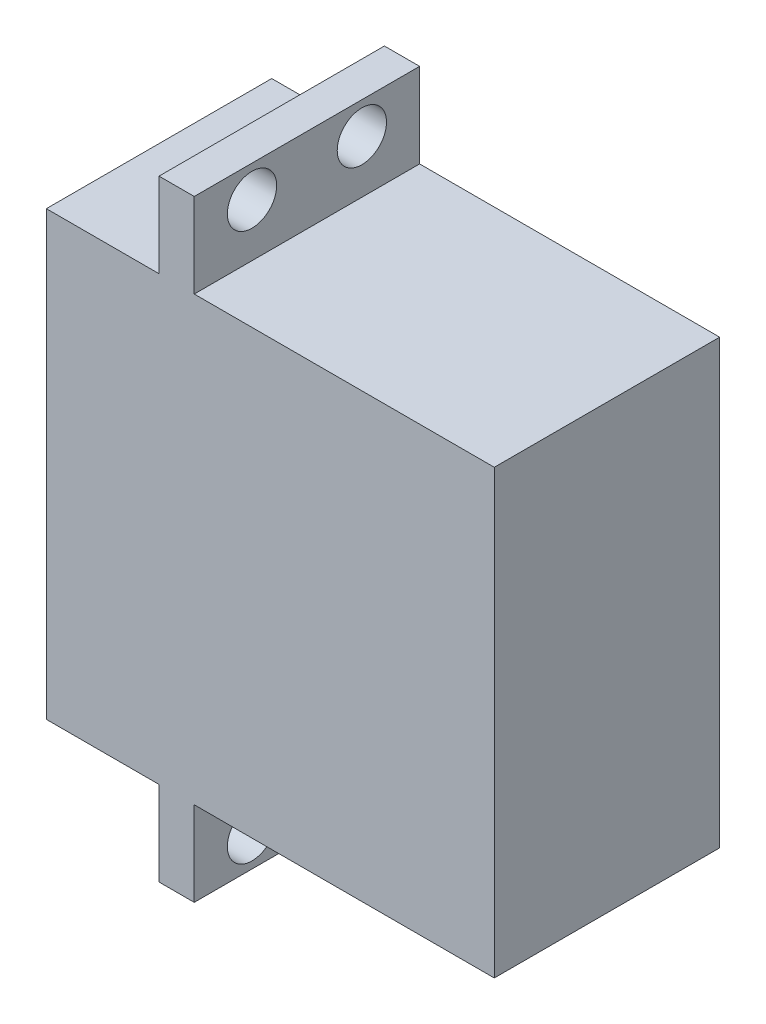
ISO-10303-21;
HEADER;
FILE_DESCRIPTION(('STEP AP214'),'2;1');
FILE_NAME('part.step','',(''),(''),'','','');
FILE_SCHEMA(('AUTOMOTIVE_DESIGN { 1 0 10303 214 1 1 1 1 }'));
ENDSEC;
DATA;
#1=APPLICATION_CONTEXT('core data for automotive mechanical design processes');
#2=APPLICATION_PROTOCOL_DEFINITION('international standard','automotive_design',2000,#1);
#3=PRODUCT_CONTEXT('',#1,'mechanical');
#4=PRODUCT('Part','Part','',(#3));
#5=PRODUCT_RELATED_PRODUCT_CATEGORY('part','',(#4));
#6=PRODUCT_DEFINITION_FORMATION('','',#4);
#7=PRODUCT_DEFINITION_CONTEXT('part definition',#1,'design');
#8=PRODUCT_DEFINITION('design','',#6,#7);
#9=PRODUCT_DEFINITION_SHAPE('','',#8);
#10=(LENGTH_UNIT() NAMED_UNIT(*) SI_UNIT(.MILLI.,.METRE.));
#11=(NAMED_UNIT(*) PLANE_ANGLE_UNIT() SI_UNIT($,.RADIAN.));
#12=(NAMED_UNIT(*) SI_UNIT($,.STERADIAN.) SOLID_ANGLE_UNIT());
#13=UNCERTAINTY_MEASURE_WITH_UNIT(LENGTH_MEASURE(1.E-05),#10,'distance_accuracy_value','');
#14=(GEOMETRIC_REPRESENTATION_CONTEXT(3) GLOBAL_UNCERTAINTY_ASSIGNED_CONTEXT((#13)) GLOBAL_UNIT_ASSIGNED_CONTEXT((#10,
#11,#12)) REPRESENTATION_CONTEXT('',''));
#15=CARTESIAN_POINT('',(0.,0.,0.));
#16=DIRECTION('',(0.,0.,1.));
#17=DIRECTION('',(1.,0.,0.));
#18=AXIS2_PLACEMENT_3D('',#15,#16,#17);
#19=CARTESIAN_POINT('',(0.,0.,20.32));
#20=DIRECTION('',(0.,1.,0.));
#21=DIRECTION('',(0.,0.,1.));
#22=AXIS2_PLACEMENT_3D('',#19,#20,#21);
#23=PLANE('',#22);
#24=DIRECTION('',(0.,0.,-1.));
#25=VECTOR('',#24,1.);
#26=CARTESIAN_POINT('',(10.16,0.,0.));
#27=LINE('',#26,#25);
#28=CARTESIAN_POINT('',(10.16,0.,20.32));
#29=VERTEX_POINT('',#28);
#30=CARTESIAN_POINT('',(10.16,0.,0.));
#31=VERTEX_POINT('',#30);
#32=EDGE_CURVE('E50',#29,#31,#27,.T.);
#33=ORIENTED_EDGE('',*,*,#32,.F.);
#34=DIRECTION('',(1.,0.,0.));
#35=VECTOR('',#34,1.);
#36=CARTESIAN_POINT('',(0.,0.,20.32));
#37=LINE('',#36,#35);
#38=CARTESIAN_POINT('',(0.,0.,20.32));
#39=VERTEX_POINT('',#38);
#40=EDGE_CURVE('E187',#39,#29,#37,.T.);
#41=ORIENTED_EDGE('',*,*,#40,.F.);
#42=DIRECTION('',(0.,0.,-1.));
#43=VECTOR('',#42,1.);
#44=CARTESIAN_POINT('',(0.,0.,20.32));
#45=LINE('',#44,#43);
#46=CARTESIAN_POINT('',(0.,0.,0.));
#47=VERTEX_POINT('',#46);
#48=EDGE_CURVE('E42',#39,#47,#45,.T.);
#49=ORIENTED_EDGE('',*,*,#48,.T.);
#50=DIRECTION('',(1.,0.,0.));
#51=VECTOR('',#50,1.);
#52=CARTESIAN_POINT('',(0.,0.,0.));
#53=LINE('',#52,#51);
#54=EDGE_CURVE('E199',#47,#31,#53,.T.);
#55=ORIENTED_EDGE('',*,*,#54,.T.);
#56=EDGE_LOOP('',(#33,#41,#49,#55));
#57=FACE_BOUND('',#56,.T.);
#58=ADVANCED_FACE('F33',(#57),#23,.F.);
#59=DIRECTION('',(0.,0.,1.));
#60=VECTOR('',#59,1.);
#61=CARTESIAN_POINT('',(13.335,0.,0.));
#62=LINE('',#61,#60);
#63=CARTESIAN_POINT('',(13.335,0.,0.));
#64=VERTEX_POINT('',#63);
#65=CARTESIAN_POINT('',(13.335,0.,20.32));
#66=VERTEX_POINT('',#65);
#67=EDGE_CURVE('E58',#64,#66,#62,.T.);
#68=ORIENTED_EDGE('',*,*,#67,.F.);
#69=CARTESIAN_POINT('',(40.386,0.,0.));
#70=VERTEX_POINT('',#69);
#71=EDGE_CURVE('E198',#64,#70,#53,.T.);
#72=ORIENTED_EDGE('',*,*,#71,.T.);
#73=DIRECTION('',(0.,0.,-1.));
#74=VECTOR('',#73,1.);
#75=CARTESIAN_POINT('',(40.386,0.,20.32));
#76=LINE('',#75,#74);
#77=CARTESIAN_POINT('',(40.386,0.,20.32));
#78=VERTEX_POINT('',#77);
#79=EDGE_CURVE('E210',#78,#70,#76,.T.);
#80=ORIENTED_EDGE('',*,*,#79,.F.);
#81=EDGE_CURVE('E185',#66,#78,#37,.T.);
#82=ORIENTED_EDGE('',*,*,#81,.F.);
#83=EDGE_LOOP('',(#68,#72,#80,#82));
#84=FACE_BOUND('',#83,.T.);
#85=ADVANCED_FACE('F271',(#84),#23,.F.);
#86=CARTESIAN_POINT('',(0.,39.878,20.32));
#87=DIRECTION('',(0.,-1.,0.));
#88=DIRECTION('',(0.,0.,-1.));
#89=AXIS2_PLACEMENT_3D('',#86,#87,#88);
#90=PLANE('',#89);
#91=DIRECTION('',(0.,0.,1.));
#92=VECTOR('',#91,1.);
#93=CARTESIAN_POINT('',(10.16,39.878,20.32));
#94=LINE('',#93,#92);
#95=CARTESIAN_POINT('',(10.16,39.878,0.));
#96=VERTEX_POINT('',#95);
#97=CARTESIAN_POINT('',(10.16,39.878,20.32));
#98=VERTEX_POINT('',#97);
#99=EDGE_CURVE('E146',#96,#98,#94,.T.);
#100=ORIENTED_EDGE('',*,*,#99,.F.);
#101=DIRECTION('',(-1.,0.,0.));
#102=VECTOR('',#101,1.);
#103=CARTESIAN_POINT('',(0.,39.878,0.));
#104=LINE('',#103,#102);
#105=CARTESIAN_POINT('',(0.,39.878,0.));
#106=VERTEX_POINT('',#105);
#107=EDGE_CURVE('E203',#96,#106,#104,.T.);
#108=ORIENTED_EDGE('',*,*,#107,.T.);
#109=DIRECTION('',(0.,0.,-1.));
#110=VECTOR('',#109,1.);
#111=CARTESIAN_POINT('',(0.,39.878,20.32));
#112=LINE('',#111,#110);
#113=CARTESIAN_POINT('',(0.,39.878,20.32));
#114=VERTEX_POINT('',#113);
#115=EDGE_CURVE('E195',#114,#106,#112,.T.);
#116=ORIENTED_EDGE('',*,*,#115,.F.);
#117=DIRECTION('',(-1.,0.,0.));
#118=VECTOR('',#117,1.);
#119=CARTESIAN_POINT('',(0.,39.878,20.32));
#120=LINE('',#119,#118);
#121=EDGE_CURVE('E191',#98,#114,#120,.T.);
#122=ORIENTED_EDGE('',*,*,#121,.F.);
#123=EDGE_LOOP('',(#100,#108,#116,#122));
#124=FACE_BOUND('',#123,.T.);
#125=ADVANCED_FACE('F275',(#124),#90,.F.);
#126=DIRECTION('',(0.,0.,-1.));
#127=VECTOR('',#126,1.);
#128=CARTESIAN_POINT('',(13.335,39.878,20.32));
#129=LINE('',#128,#127);
#130=CARTESIAN_POINT('',(13.335,39.878,20.32));
#131=VERTEX_POINT('',#130);
#132=CARTESIAN_POINT('',(13.335,39.878,0.));
#133=VERTEX_POINT('',#132);
#134=EDGE_CURVE('E149',#131,#133,#129,.T.);
#135=ORIENTED_EDGE('',*,*,#134,.F.);
#136=CARTESIAN_POINT('',(40.386,39.878,20.32));
#137=VERTEX_POINT('',#136);
#138=EDGE_CURVE('E192',#137,#131,#120,.T.);
#139=ORIENTED_EDGE('',*,*,#138,.F.);
#140=DIRECTION('',(0.,0.,-1.));
#141=VECTOR('',#140,1.);
#142=CARTESIAN_POINT('',(40.386,39.878,20.32));
#143=LINE('',#142,#141);
#144=CARTESIAN_POINT('',(40.386,39.878,0.));
#145=VERTEX_POINT('',#144);
#146=EDGE_CURVE('E207',#137,#145,#143,.T.);
#147=ORIENTED_EDGE('',*,*,#146,.T.);
#148=EDGE_CURVE('E186',#145,#133,#104,.T.);
#149=ORIENTED_EDGE('',*,*,#148,.T.);
#150=EDGE_LOOP('',(#135,#139,#147,#149));
#151=FACE_BOUND('',#150,.T.);
#152=ADVANCED_FACE('F283',(#151),#90,.F.);
#153=CARTESIAN_POINT('',(0.,0.,20.32));
#154=DIRECTION('',(1.,0.,0.));
#155=DIRECTION('',(0.,1.,0.));
#156=AXIS2_PLACEMENT_3D('',#153,#154,#155);
#157=PLANE('',#156);
#158=CARTESIAN_POINT('',(0.,30.607,10.16));
#159=DIRECTION('',(1.,0.,0.));
#160=DIRECTION('',(0.,1.,0.));
#161=AXIS2_PLACEMENT_3D('',#158,#159,#160);
#162=CIRCLE('',#161,2.9464);
#163=CARTESIAN_POINT('',(0.,33.5534,10.16));
#164=VERTEX_POINT('',#163);
#165=EDGE_CURVE('E11',#164,#164,#162,.F.);
#166=ORIENTED_EDGE('',*,*,#165,.F.);
#167=EDGE_LOOP('',(#166));
#168=FACE_BOUND('',#167,.T.);
#169=DIRECTION('',(0.,-1.,0.));
#170=VECTOR('',#169,1.);
#171=CARTESIAN_POINT('',(0.,0.,0.));
#172=LINE('',#171,#170);
#173=EDGE_CURVE('E181',#106,#47,#172,.T.);
#174=ORIENTED_EDGE('',*,*,#173,.T.);
#175=ORIENTED_EDGE('',*,*,#48,.F.);
#176=DIRECTION('',(0.,-1.,0.));
#177=VECTOR('',#176,1.);
#178=CARTESIAN_POINT('',(0.,0.,20.32));
#179=LINE('',#178,#177);
#180=EDGE_CURVE('E182',#114,#39,#179,.T.);
#181=ORIENTED_EDGE('',*,*,#180,.F.);
#182=ORIENTED_EDGE('',*,*,#115,.T.);
#183=EDGE_LOOP('',(#174,#175,#181,#182));
#184=FACE_BOUND('',#183,.T.);
#185=ADVANCED_FACE('F35',(#168,#184),#157,.F.);
#186=CARTESIAN_POINT('',(40.386,0.,20.32));
#187=DIRECTION('',(-1.,0.,0.));
#188=DIRECTION('',(0.,-1.,0.));
#189=AXIS2_PLACEMENT_3D('',#186,#187,#188);
#190=PLANE('',#189);
#191=DIRECTION('',(0.,1.,0.));
#192=VECTOR('',#191,1.);
#193=CARTESIAN_POINT('',(40.386,0.,0.));
#194=LINE('',#193,#192);
#195=EDGE_CURVE('E201',#70,#145,#194,.T.);
#196=ORIENTED_EDGE('',*,*,#195,.T.);
#197=ORIENTED_EDGE('',*,*,#146,.F.);
#198=DIRECTION('',(0.,1.,0.));
#199=VECTOR('',#198,1.);
#200=CARTESIAN_POINT('',(40.386,0.,20.32));
#201=LINE('',#200,#199);
#202=EDGE_CURVE('E189',#78,#137,#201,.T.);
#203=ORIENTED_EDGE('',*,*,#202,.F.);
#204=ORIENTED_EDGE('',*,*,#79,.T.);
#205=EDGE_LOOP('',(#196,#197,#203,#204));
#206=FACE_BOUND('',#205,.T.);
#207=ADVANCED_FACE('F277',(#206),#190,.F.);
#208=CARTESIAN_POINT('',(0.,0.,20.32));
#209=DIRECTION('',(0.,0.,-1.));
#210=DIRECTION('',(-1.,0.,0.));
#211=AXIS2_PLACEMENT_3D('',#208,#209,#210);
#212=PLANE('',#211);
#213=ORIENTED_EDGE('',*,*,#180,.T.);
#214=ORIENTED_EDGE('',*,*,#40,.T.);
#215=DIRECTION('',(0.,1.,0.));
#216=VECTOR('',#215,1.);
#217=CARTESIAN_POINT('',(10.16,-7.62,20.32));
#218=LINE('',#217,#216);
#219=CARTESIAN_POINT('',(10.16,-7.62,20.32));
#220=VERTEX_POINT('',#219);
#221=EDGE_CURVE('E248',#220,#29,#218,.T.);
#222=ORIENTED_EDGE('',*,*,#221,.F.);
#223=DIRECTION('',(-1.,0.,0.));
#224=VECTOR('',#223,1.);
#225=CARTESIAN_POINT('',(10.16,-7.62,20.32));
#226=LINE('',#225,#224);
#227=CARTESIAN_POINT('',(13.335,-7.62,20.32));
#228=VERTEX_POINT('',#227);
#229=EDGE_CURVE('E140',#228,#220,#226,.T.);
#230=ORIENTED_EDGE('',*,*,#229,.F.);
#231=DIRECTION('',(0.,1.,0.));
#232=VECTOR('',#231,1.);
#233=CARTESIAN_POINT('',(13.335,-7.62,20.32));
#234=LINE('',#233,#232);
#235=EDGE_CURVE('E151',#228,#66,#234,.T.);
#236=ORIENTED_EDGE('',*,*,#235,.T.);
#237=ORIENTED_EDGE('',*,*,#81,.T.);
#238=ORIENTED_EDGE('',*,*,#202,.T.);
#239=ORIENTED_EDGE('',*,*,#138,.T.);
#240=DIRECTION('',(0.,-1.,0.));
#241=VECTOR('',#240,1.);
#242=CARTESIAN_POINT('',(13.335,47.498,20.32));
#243=LINE('',#242,#241);
#244=CARTESIAN_POINT('',(13.335,47.498,20.32));
#245=VERTEX_POINT('',#244);
#246=EDGE_CURVE('E172',#245,#131,#243,.T.);
#247=ORIENTED_EDGE('',*,*,#246,.F.);
#248=DIRECTION('',(1.,0.,0.));
#249=VECTOR('',#248,1.);
#250=CARTESIAN_POINT('',(10.16,47.498,20.32));
#251=LINE('',#250,#249);
#252=CARTESIAN_POINT('',(10.16,47.498,20.32));
#253=VERTEX_POINT('',#252);
#254=EDGE_CURVE('E158',#253,#245,#251,.T.);
#255=ORIENTED_EDGE('',*,*,#254,.F.);
#256=DIRECTION('',(0.,-1.,0.));
#257=VECTOR('',#256,1.);
#258=CARTESIAN_POINT('',(10.16,47.498,20.32));
#259=LINE('',#258,#257);
#260=EDGE_CURVE('E175',#253,#98,#259,.T.);
#261=ORIENTED_EDGE('',*,*,#260,.T.);
#262=ORIENTED_EDGE('',*,*,#121,.T.);
#263=EDGE_LOOP('',(#213,#214,#222,#230,#236,#237,#238,#239,#247,#255,#261,#262));
#264=FACE_BOUND('',#263,.T.);
#265=ADVANCED_FACE('F254',(#264),#212,.F.);
#266=CARTESIAN_POINT('',(0.,0.,0.));
#267=DIRECTION('',(0.,0.,-1.));
#268=DIRECTION('',(-1.,0.,0.));
#269=AXIS2_PLACEMENT_3D('',#266,#267,#268);
#270=PLANE('',#269);
#271=ORIENTED_EDGE('',*,*,#173,.F.);
#272=ORIENTED_EDGE('',*,*,#107,.F.);
#273=DIRECTION('',(0.,-1.,0.));
#274=VECTOR('',#273,1.);
#275=CARTESIAN_POINT('',(10.16,47.498,0.));
#276=LINE('',#275,#274);
#277=CARTESIAN_POINT('',(10.16,47.498,0.));
#278=VERTEX_POINT('',#277);
#279=EDGE_CURVE('E163',#278,#96,#276,.T.);
#280=ORIENTED_EDGE('',*,*,#279,.F.);
#281=DIRECTION('',(-1.,0.,0.));
#282=VECTOR('',#281,1.);
#283=CARTESIAN_POINT('',(10.16,47.498,0.));
#284=LINE('',#283,#282);
#285=CARTESIAN_POINT('',(13.335,47.498,0.));
#286=VERTEX_POINT('',#285);
#287=EDGE_CURVE('E162',#286,#278,#284,.T.);
#288=ORIENTED_EDGE('',*,*,#287,.F.);
#289=DIRECTION('',(0.,-1.,0.));
#290=VECTOR('',#289,1.);
#291=CARTESIAN_POINT('',(13.335,47.498,0.));
#292=LINE('',#291,#290);
#293=EDGE_CURVE('E169',#286,#133,#292,.T.);
#294=ORIENTED_EDGE('',*,*,#293,.T.);
#295=ORIENTED_EDGE('',*,*,#148,.F.);
#296=ORIENTED_EDGE('',*,*,#195,.F.);
#297=ORIENTED_EDGE('',*,*,#71,.F.);
#298=DIRECTION('',(0.,1.,0.));
#299=VECTOR('',#298,1.);
#300=CARTESIAN_POINT('',(13.335,-7.62,0.));
#301=LINE('',#300,#299);
#302=CARTESIAN_POINT('',(13.335,-7.62,0.));
#303=VERTEX_POINT('',#302);
#304=EDGE_CURVE('E131',#303,#64,#301,.T.);
#305=ORIENTED_EDGE('',*,*,#304,.F.);
#306=DIRECTION('',(1.,0.,0.));
#307=VECTOR('',#306,1.);
#308=CARTESIAN_POINT('',(10.16,-7.62,0.));
#309=LINE('',#308,#307);
#310=CARTESIAN_POINT('',(10.16,-7.62,0.));
#311=VERTEX_POINT('',#310);
#312=EDGE_CURVE('E124',#311,#303,#309,.T.);
#313=ORIENTED_EDGE('',*,*,#312,.F.);
#314=DIRECTION('',(0.,1.,0.));
#315=VECTOR('',#314,1.);
#316=CARTESIAN_POINT('',(10.16,-7.62,0.));
#317=LINE('',#316,#315);
#318=EDGE_CURVE('E129',#311,#31,#317,.T.);
#319=ORIENTED_EDGE('',*,*,#318,.T.);
#320=ORIENTED_EDGE('',*,*,#54,.F.);
#321=EDGE_LOOP('',(#271,#272,#280,#288,#294,#295,#296,#297,#305,#313,#319,#320));
#322=FACE_BOUND('',#321,.T.);
#323=ADVANCED_FACE('F127',(#322),#270,.T.);
#324=CARTESIAN_POINT('',(-5.08,30.607,10.16));
#325=DIRECTION('',(1.,0.,0.));
#326=DIRECTION('',(0.,0.,-1.));
#327=AXIS2_PLACEMENT_3D('',#324,#325,#326);
#328=CYLINDRICAL_SURFACE('',#327,2.9464);
#329=CARTESIAN_POINT('',(-5.08,30.607,10.16));
#330=DIRECTION('',(-1.,0.,0.));
#331=DIRECTION('',(0.,0.,1.));
#332=AXIS2_PLACEMENT_3D('',#329,#330,#331);
#333=CIRCLE('',#332,2.9464);
#334=CARTESIAN_POINT('',(-5.08,30.607,13.1064));
#335=VERTEX_POINT('',#334);
#336=EDGE_CURVE('E178',#335,#335,#333,.T.);
#337=ORIENTED_EDGE('',*,*,#336,.F.);
#338=EDGE_LOOP('',(#337));
#339=FACE_BOUND('',#338,.T.);
#340=ORIENTED_EDGE('',*,*,#165,.T.);
#341=EDGE_LOOP('',(#340));
#342=FACE_BOUND('',#341,.T.);
#343=ADVANCED_FACE('F287',(#339,#342),#328,.T.);
#344=CARTESIAN_POINT('',(-5.08,30.607,10.16));
#345=DIRECTION('',(-1.,0.,0.));
#346=DIRECTION('',(0.,0.,1.));
#347=AXIS2_PLACEMENT_3D('',#344,#345,#346);
#348=PLANE('',#347);
#349=CARTESIAN_POINT('',(-5.08,30.607,10.16));
#350=DIRECTION('',(-1.,0.,0.));
#351=DIRECTION('',(0.,0.,1.));
#352=AXIS2_PLACEMENT_3D('',#349,#350,#351);
#353=CIRCLE('',#352,1.5875);
#354=CARTESIAN_POINT('',(-5.08,30.607,11.7475));
#355=VERTEX_POINT('',#354);
#356=EDGE_CURVE('E227',#355,#355,#353,.T.);
#357=ORIENTED_EDGE('',*,*,#356,.F.);
#358=EDGE_LOOP('',(#357));
#359=FACE_BOUND('',#358,.T.);
#360=ORIENTED_EDGE('',*,*,#336,.T.);
#361=EDGE_LOOP('',(#360));
#362=FACE_BOUND('',#361,.T.);
#363=ADVANCED_FACE('F292',(#359,#362),#348,.T.);
#364=CARTESIAN_POINT('',(10.16,47.498,20.32));
#365=DIRECTION('',(1.,0.,0.));
#366=DIRECTION('',(0.,0.,-1.));
#367=AXIS2_PLACEMENT_3D('',#364,#365,#366);
#368=PLANE('',#367);
#369=CARTESIAN_POINT('',(10.16,44.6405,5.207));
#370=DIRECTION('',(-1.,0.,0.));
#371=DIRECTION('',(0.,0.,1.));
#372=AXIS2_PLACEMENT_3D('',#369,#370,#371);
#373=CIRCLE('',#372,2.2225);
#374=CARTESIAN_POINT('',(10.16,44.6405,7.4295));
#375=VERTEX_POINT('',#374);
#376=EDGE_CURVE('E219',#375,#375,#373,.T.);
#377=ORIENTED_EDGE('',*,*,#376,.F.);
#378=EDGE_LOOP('',(#377));
#379=FACE_BOUND('',#378,.T.);
#380=CARTESIAN_POINT('',(10.16,44.6405,15.113));
#381=DIRECTION('',(-1.,0.,0.));
#382=DIRECTION('',(0.,0.,1.));
#383=AXIS2_PLACEMENT_3D('',#380,#381,#382);
#384=CIRCLE('',#383,2.2225);
#385=CARTESIAN_POINT('',(10.16,44.6405,17.3355));
#386=VERTEX_POINT('',#385);
#387=EDGE_CURVE('E239',#386,#386,#384,.T.);
#388=ORIENTED_EDGE('',*,*,#387,.F.);
#389=EDGE_LOOP('',(#388));
#390=FACE_BOUND('',#389,.T.);
#391=ORIENTED_EDGE('',*,*,#99,.T.);
#392=ORIENTED_EDGE('',*,*,#260,.F.);
#393=DIRECTION('',(0.,0.,1.));
#394=VECTOR('',#393,1.);
#395=CARTESIAN_POINT('',(10.16,47.498,20.32));
#396=LINE('',#395,#394);
#397=EDGE_CURVE('E155',#278,#253,#396,.T.);
#398=ORIENTED_EDGE('',*,*,#397,.F.);
#399=ORIENTED_EDGE('',*,*,#279,.T.);
#400=EDGE_LOOP('',(#391,#392,#398,#399));
#401=FACE_BOUND('',#400,.T.);
#402=ADVANCED_FACE('F296',(#379,#390,#401),#368,.F.);
#403=CARTESIAN_POINT('',(13.335,47.498,20.32));
#404=DIRECTION('',(-1.,0.,0.));
#405=DIRECTION('',(0.,0.,1.));
#406=AXIS2_PLACEMENT_3D('',#403,#404,#405);
#407=PLANE('',#406);
#408=CARTESIAN_POINT('',(13.335,44.6405,5.207));
#409=DIRECTION('',(-1.,0.,0.));
#410=DIRECTION('',(0.,0.,1.));
#411=AXIS2_PLACEMENT_3D('',#408,#409,#410);
#412=CIRCLE('',#411,2.2225);
#413=CARTESIAN_POINT('',(13.335,44.6405,7.4295));
#414=VERTEX_POINT('',#413);
#415=EDGE_CURVE('E218',#414,#414,#412,.T.);
#416=ORIENTED_EDGE('',*,*,#415,.T.);
#417=EDGE_LOOP('',(#416));
#418=FACE_BOUND('',#417,.T.);
#419=CARTESIAN_POINT('',(13.335,44.6405,15.113));
#420=DIRECTION('',(-1.,0.,0.));
#421=DIRECTION('',(0.,0.,1.));
#422=AXIS2_PLACEMENT_3D('',#419,#420,#421);
#423=CIRCLE('',#422,2.2225);
#424=CARTESIAN_POINT('',(13.335,44.6405,17.3355));
#425=VERTEX_POINT('',#424);
#426=EDGE_CURVE('E215',#425,#425,#423,.T.);
#427=ORIENTED_EDGE('',*,*,#426,.T.);
#428=EDGE_LOOP('',(#427));
#429=FACE_BOUND('',#428,.T.);
#430=ORIENTED_EDGE('',*,*,#134,.T.);
#431=ORIENTED_EDGE('',*,*,#293,.F.);
#432=DIRECTION('',(0.,0.,-1.));
#433=VECTOR('',#432,1.);
#434=CARTESIAN_POINT('',(13.335,47.498,20.32));
#435=LINE('',#434,#433);
#436=EDGE_CURVE('E160',#245,#286,#435,.T.);
#437=ORIENTED_EDGE('',*,*,#436,.F.);
#438=ORIENTED_EDGE('',*,*,#246,.T.);
#439=EDGE_LOOP('',(#430,#431,#437,#438));
#440=FACE_BOUND('',#439,.T.);
#441=ADVANCED_FACE('F300',(#418,#429,#440),#407,.F.);
#442=CARTESIAN_POINT('',(0.,47.498,0.));
#443=DIRECTION('',(0.,-1.,0.));
#444=DIRECTION('',(0.,0.,-1.));
#445=AXIS2_PLACEMENT_3D('',#442,#443,#444);
#446=PLANE('',#445);
#447=ORIENTED_EDGE('',*,*,#397,.T.);
#448=ORIENTED_EDGE('',*,*,#254,.T.);
#449=ORIENTED_EDGE('',*,*,#436,.T.);
#450=ORIENTED_EDGE('',*,*,#287,.T.);
#451=EDGE_LOOP('',(#447,#448,#449,#450));
#452=FACE_BOUND('',#451,.T.);
#453=ADVANCED_FACE('F267',(#452),#446,.F.);
#454=CARTESIAN_POINT('',(10.16,-7.62,0.));
#455=DIRECTION('',(1.,0.,0.));
#456=DIRECTION('',(0.,0.,-1.));
#457=AXIS2_PLACEMENT_3D('',#454,#455,#456);
#458=PLANE('',#457);
#459=CARTESIAN_POINT('',(10.16,-4.7625,15.113));
#460=DIRECTION('',(-1.,0.,0.));
#461=DIRECTION('',(0.,0.,1.));
#462=AXIS2_PLACEMENT_3D('',#459,#460,#461);
#463=CIRCLE('',#462,2.2225);
#464=CARTESIAN_POINT('',(10.16,-4.7625,17.3355));
#465=VERTEX_POINT('',#464);
#466=EDGE_CURVE('E223',#465,#465,#463,.T.);
#467=ORIENTED_EDGE('',*,*,#466,.F.);
#468=EDGE_LOOP('',(#467));
#469=FACE_BOUND('',#468,.T.);
#470=CARTESIAN_POINT('',(10.16,-4.7625,5.207));
#471=DIRECTION('',(-1.,0.,0.));
#472=DIRECTION('',(0.,0.,1.));
#473=AXIS2_PLACEMENT_3D('',#470,#471,#472);
#474=CIRCLE('',#473,2.2225);
#475=CARTESIAN_POINT('',(10.16,-4.7625,7.4295));
#476=VERTEX_POINT('',#475);
#477=EDGE_CURVE('E229',#476,#476,#474,.T.);
#478=ORIENTED_EDGE('',*,*,#477,.F.);
#479=EDGE_LOOP('',(#478));
#480=FACE_BOUND('',#479,.T.);
#481=ORIENTED_EDGE('',*,*,#32,.T.);
#482=ORIENTED_EDGE('',*,*,#318,.F.);
#483=DIRECTION('',(0.,0.,-1.));
#484=VECTOR('',#483,1.);
#485=CARTESIAN_POINT('',(10.16,-7.62,0.));
#486=LINE('',#485,#484);
#487=EDGE_CURVE('E135',#220,#311,#486,.T.);
#488=ORIENTED_EDGE('',*,*,#487,.F.);
#489=ORIENTED_EDGE('',*,*,#221,.T.);
#490=EDGE_LOOP('',(#481,#482,#488,#489));
#491=FACE_BOUND('',#490,.T.);
#492=ADVANCED_FACE('F145',(#469,#480,#491),#458,.F.);
#493=CARTESIAN_POINT('',(13.335,-7.62,0.));
#494=DIRECTION('',(-1.,0.,0.));
#495=DIRECTION('',(0.,0.,1.));
#496=AXIS2_PLACEMENT_3D('',#493,#494,#495);
#497=PLANE('',#496);
#498=CARTESIAN_POINT('',(13.335,-4.7625,15.113));
#499=DIRECTION('',(-1.,0.,0.));
#500=DIRECTION('',(0.,0.,1.));
#501=AXIS2_PLACEMENT_3D('',#498,#499,#500);
#502=CIRCLE('',#501,2.2225);
#503=CARTESIAN_POINT('',(13.335,-4.7625,17.3355));
#504=VERTEX_POINT('',#503);
#505=EDGE_CURVE('E37',#504,#504,#502,.T.);
#506=ORIENTED_EDGE('',*,*,#505,.T.);
#507=EDGE_LOOP('',(#506));
#508=FACE_BOUND('',#507,.T.);
#509=CARTESIAN_POINT('',(13.335,-4.7625,5.207));
#510=DIRECTION('',(-1.,0.,0.));
#511=DIRECTION('',(0.,0.,1.));
#512=AXIS2_PLACEMENT_3D('',#509,#510,#511);
#513=CIRCLE('',#512,2.2225);
#514=CARTESIAN_POINT('',(13.335,-4.7625,7.4295));
#515=VERTEX_POINT('',#514);
#516=EDGE_CURVE('E221',#515,#515,#513,.T.);
#517=ORIENTED_EDGE('',*,*,#516,.T.);
#518=EDGE_LOOP('',(#517));
#519=FACE_BOUND('',#518,.T.);
#520=ORIENTED_EDGE('',*,*,#67,.T.);
#521=ORIENTED_EDGE('',*,*,#235,.F.);
#522=DIRECTION('',(0.,0.,1.));
#523=VECTOR('',#522,1.);
#524=CARTESIAN_POINT('',(13.335,-7.62,0.));
#525=LINE('',#524,#523);
#526=EDGE_CURVE('E134',#303,#228,#525,.T.);
#527=ORIENTED_EDGE('',*,*,#526,.F.);
#528=ORIENTED_EDGE('',*,*,#304,.T.);
#529=EDGE_LOOP('',(#520,#521,#527,#528));
#530=FACE_BOUND('',#529,.T.);
#531=ADVANCED_FACE('F257',(#508,#519,#530),#497,.F.);
#532=CARTESIAN_POINT('',(0.,-7.62,0.));
#533=DIRECTION('',(0.,1.,0.));
#534=DIRECTION('',(0.,0.,1.));
#535=AXIS2_PLACEMENT_3D('',#532,#533,#534);
#536=PLANE('',#535);
#537=ORIENTED_EDGE('',*,*,#487,.T.);
#538=ORIENTED_EDGE('',*,*,#312,.T.);
#539=ORIENTED_EDGE('',*,*,#526,.T.);
#540=ORIENTED_EDGE('',*,*,#229,.T.);
#541=EDGE_LOOP('',(#537,#538,#539,#540));
#542=FACE_BOUND('',#541,.T.);
#543=ADVANCED_FACE('F138',(#542),#536,.F.);
#544=CARTESIAN_POINT('',(40.386,44.6405,15.113));
#545=DIRECTION('',(-1.,0.,0.));
#546=DIRECTION('',(0.,0.,1.));
#547=AXIS2_PLACEMENT_3D('',#544,#545,#546);
#548=CYLINDRICAL_SURFACE('',#547,2.2225);
#549=ORIENTED_EDGE('',*,*,#387,.T.);
#550=EDGE_LOOP('',(#549));
#551=FACE_BOUND('',#550,.T.);
#552=ORIENTED_EDGE('',*,*,#426,.F.);
#553=EDGE_LOOP('',(#552));
#554=FACE_BOUND('',#553,.T.);
#555=ADVANCED_FACE('F265',(#551,#554),#548,.F.);
#556=CARTESIAN_POINT('',(40.386,44.6405,5.207));
#557=DIRECTION('',(-1.,0.,0.));
#558=DIRECTION('',(0.,0.,1.));
#559=AXIS2_PLACEMENT_3D('',#556,#557,#558);
#560=CYLINDRICAL_SURFACE('',#559,2.2225);
#561=ORIENTED_EDGE('',*,*,#376,.T.);
#562=EDGE_LOOP('',(#561));
#563=FACE_BOUND('',#562,.T.);
#564=ORIENTED_EDGE('',*,*,#415,.F.);
#565=EDGE_LOOP('',(#564));
#566=FACE_BOUND('',#565,.T.);
#567=ADVANCED_FACE('F393',(#563,#566),#560,.F.);
#568=CARTESIAN_POINT('',(1.27,30.607,10.16));
#569=DIRECTION('',(-1.,0.,0.));
#570=DIRECTION('',(0.,0.,1.));
#571=AXIS2_PLACEMENT_3D('',#568,#569,#570);
#572=CYLINDRICAL_SURFACE('',#571,1.5875);
#573=CARTESIAN_POINT('',(1.27,30.607,10.16));
#574=DIRECTION('',(-1.,0.,0.));
#575=DIRECTION('',(0.,0.,1.));
#576=AXIS2_PLACEMENT_3D('',#573,#574,#575);
#577=CIRCLE('',#576,1.5875);
#578=CARTESIAN_POINT('',(1.27,30.607,11.7475));
#579=VERTEX_POINT('',#578);
#580=EDGE_CURVE('E236',#579,#579,#577,.T.);
#581=ORIENTED_EDGE('',*,*,#580,.F.);
#582=EDGE_LOOP('',(#581));
#583=FACE_BOUND('',#582,.T.);
#584=ORIENTED_EDGE('',*,*,#356,.T.);
#585=EDGE_LOOP('',(#584));
#586=FACE_BOUND('',#585,.T.);
#587=ADVANCED_FACE('F403',(#583,#586),#572,.F.);
#588=CARTESIAN_POINT('',(1.27,30.607,10.16));
#589=DIRECTION('',(-1.,0.,0.));
#590=DIRECTION('',(0.,0.,1.));
#591=AXIS2_PLACEMENT_3D('',#588,#589,#590);
#592=PLANE('',#591);
#593=ORIENTED_EDGE('',*,*,#580,.T.);
#594=EDGE_LOOP('',(#593));
#595=FACE_BOUND('',#594,.T.);
#596=ADVANCED_FACE('F420',(#595),#592,.T.);
#597=CARTESIAN_POINT('',(40.386,-4.7625,5.207));
#598=DIRECTION('',(-1.,0.,0.));
#599=DIRECTION('',(0.,0.,1.));
#600=AXIS2_PLACEMENT_3D('',#597,#598,#599);
#601=CYLINDRICAL_SURFACE('',#600,2.2225);
#602=ORIENTED_EDGE('',*,*,#477,.T.);
#603=EDGE_LOOP('',(#602));
#604=FACE_BOUND('',#603,.T.);
#605=ORIENTED_EDGE('',*,*,#516,.F.);
#606=EDGE_LOOP('',(#605));
#607=FACE_BOUND('',#606,.T.);
#608=ADVANCED_FACE('F430',(#604,#607),#601,.F.);
#609=CARTESIAN_POINT('',(40.386,-4.7625,15.113));
#610=DIRECTION('',(-1.,0.,0.));
#611=DIRECTION('',(0.,0.,1.));
#612=AXIS2_PLACEMENT_3D('',#609,#610,#611);
#613=CYLINDRICAL_SURFACE('',#612,2.2225);
#614=ORIENTED_EDGE('',*,*,#466,.T.);
#615=EDGE_LOOP('',(#614));
#616=FACE_BOUND('',#615,.T.);
#617=ORIENTED_EDGE('',*,*,#505,.F.);
#618=EDGE_LOOP('',(#617));
#619=FACE_BOUND('',#618,.T.);
#620=ADVANCED_FACE('F448',(#616,#619),#613,.F.);
#621=CLOSED_SHELL('',(#58,#85,#125,#152,#185,#207,#265,#323,#343,#363,#402,#441,#453,#492,#531,
#543,#555,#567,#587,#596,#608,#620));
#622=MANIFOLD_SOLID_BREP('B2',#621);
#623=ADVANCED_BREP_SHAPE_REPRESENTATION('',(#18,#622),#14);
#624=SHAPE_DEFINITION_REPRESENTATION(#9,#623);
ENDSEC;
END-ISO-10303-21;
